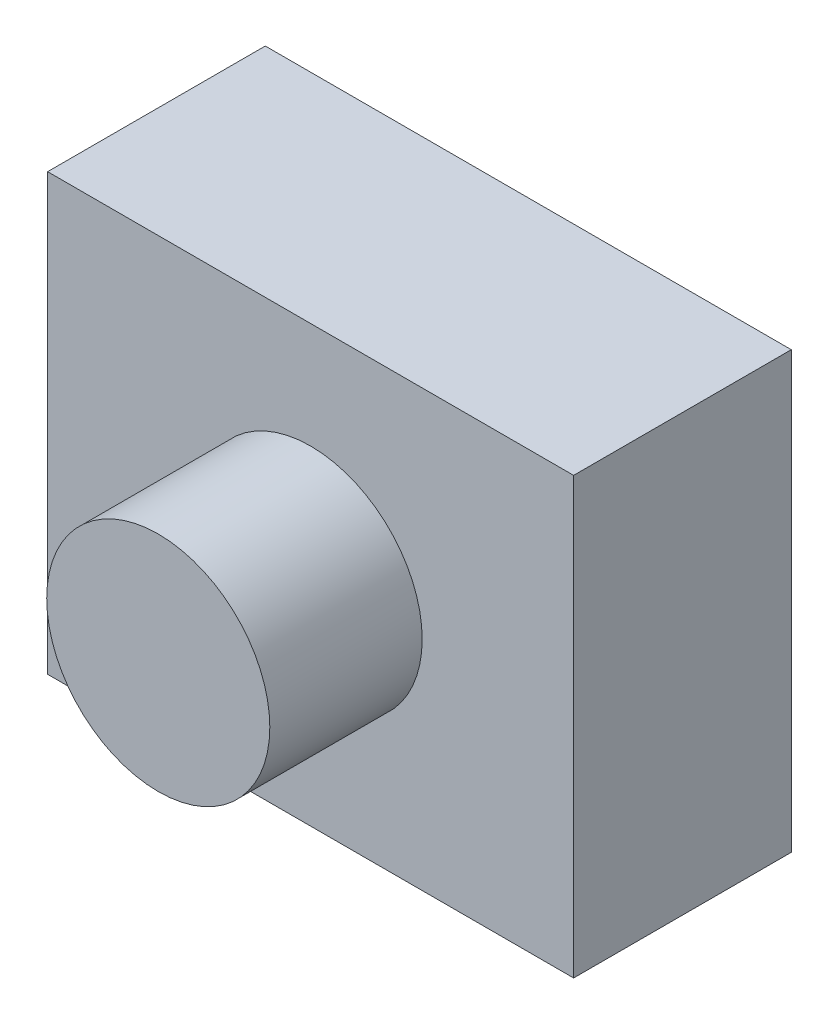
ISO-10303-21;
HEADER;
FILE_DESCRIPTION(('STEP AP214'),'2;1');
FILE_NAME('part.step','',(''),(''),'','','');
FILE_SCHEMA(('AUTOMOTIVE_DESIGN { 1 0 10303 214 1 1 1 1 }'));
ENDSEC;
DATA;
#1=APPLICATION_CONTEXT('core data for automotive mechanical design processes');
#2=APPLICATION_PROTOCOL_DEFINITION('international standard','automotive_design',2000,#1);
#3=PRODUCT_CONTEXT('',#1,'mechanical');
#4=PRODUCT('Part','Part','',(#3));
#5=PRODUCT_RELATED_PRODUCT_CATEGORY('part','',(#4));
#6=PRODUCT_DEFINITION_FORMATION('','',#4);
#7=PRODUCT_DEFINITION_CONTEXT('part definition',#1,'design');
#8=PRODUCT_DEFINITION('design','',#6,#7);
#9=PRODUCT_DEFINITION_SHAPE('','',#8);
#10=(LENGTH_UNIT() NAMED_UNIT(*) SI_UNIT(.MILLI.,.METRE.));
#11=(NAMED_UNIT(*) PLANE_ANGLE_UNIT() SI_UNIT($,.RADIAN.));
#12=(NAMED_UNIT(*) SI_UNIT($,.STERADIAN.) SOLID_ANGLE_UNIT());
#13=UNCERTAINTY_MEASURE_WITH_UNIT(LENGTH_MEASURE(1.E-05),#10,'distance_accuracy_value','');
#14=(GEOMETRIC_REPRESENTATION_CONTEXT(3) GLOBAL_UNCERTAINTY_ASSIGNED_CONTEXT((#13)) GLOBAL_UNIT_ASSIGNED_CONTEXT((#10,
#11,#12)) REPRESENTATION_CONTEXT('',''));
#15=CARTESIAN_POINT('',(0.,0.,0.));
#16=DIRECTION('',(0.,0.,1.));
#17=DIRECTION('',(1.,0.,0.));
#18=AXIS2_PLACEMENT_3D('',#15,#16,#17);
#19=CARTESIAN_POINT('',(-33.,0.,0.));
#20=DIRECTION('',(0.,1.,0.));
#21=DIRECTION('',(0.,0.,1.));
#22=AXIS2_PLACEMENT_3D('',#19,#20,#21);
#23=PLANE('',#22);
#24=DIRECTION('',(-1.,0.,0.));
#25=VECTOR('',#24,1.);
#26=CARTESIAN_POINT('',(-33.,0.,-120.));
#27=LINE('',#26,#25);
#28=CARTESIAN_POINT('',(-23.3333333333333,0.,-120.));
#29=VERTEX_POINT('',#28);
#30=CARTESIAN_POINT('',(-33.,0.,-120.));
#31=VERTEX_POINT('',#30);
#32=EDGE_CURVE('E14',#29,#31,#27,.T.);
#33=ORIENTED_EDGE('',*,*,#32,.F.);
#34=DIRECTION('',(0.,0.,-1.));
#35=VECTOR('',#34,1.);
#36=CARTESIAN_POINT('',(-23.3333333333333,0.,0.));
#37=LINE('',#36,#35);
#38=CARTESIAN_POINT('',(-23.3333333333333,0.,-124.));
#39=VERTEX_POINT('',#38);
#40=EDGE_CURVE('E159',#29,#39,#37,.T.);
#41=ORIENTED_EDGE('',*,*,#40,.T.);
#42=DIRECTION('',(1.,0.,0.));
#43=VECTOR('',#42,1.);
#44=CARTESIAN_POINT('',(-33.,0.,-124.));
#45=LINE('',#44,#43);
#46=CARTESIAN_POINT('',(-33.,0.,-124.));
#47=VERTEX_POINT('',#46);
#48=EDGE_CURVE('E150',#47,#39,#45,.T.);
#49=ORIENTED_EDGE('',*,*,#48,.F.);
#50=DIRECTION('',(0.,0.,-1.));
#51=VECTOR('',#50,1.);
#52=CARTESIAN_POINT('',(-33.,0.,0.));
#53=LINE('',#52,#51);
#54=EDGE_CURVE('E148',#31,#47,#53,.T.);
#55=ORIENTED_EDGE('',*,*,#54,.F.);
#56=EDGE_LOOP('',(#33,#41,#49,#55));
#57=FACE_BOUND('',#56,.T.);
#58=ADVANCED_FACE('F89',(#57),#23,.T.);
#59=CARTESIAN_POINT('',(-23.3333333333333,36.7021330200372,-5.15814840999424));
#60=DIRECTION('',(-1.,0.,0.));
#61=DIRECTION('',(0.,0.,-1.));
#62=AXIS2_PLACEMENT_3D('',#59,#60,#61);
#63=PLANE('',#62);
#64=DIRECTION('',(0.,-1.,0.));
#65=VECTOR('',#64,1.);
#66=CARTESIAN_POINT('',(-23.3333333333333,36.7021330200373,-120.));
#67=LINE('',#66,#65);
#68=CARTESIAN_POINT('',(-23.3333333333333,-7.99999999999966,-120.));
#69=VERTEX_POINT('',#68);
#70=EDGE_CURVE('E98',#29,#69,#67,.T.);
#71=ORIENTED_EDGE('',*,*,#70,.T.);
#72=DIRECTION('',(0.,0.,1.));
#73=VECTOR('',#72,1.);
#74=CARTESIAN_POINT('',(-23.3333333333333,-7.99999999999966,-124.));
#75=LINE('',#74,#73);
#76=CARTESIAN_POINT('',(-23.3333333333333,-7.99999999999966,-124.));
#77=VERTEX_POINT('',#76);
#78=EDGE_CURVE('E134',#77,#69,#75,.T.);
#79=ORIENTED_EDGE('',*,*,#78,.F.);
#80=DIRECTION('',(0.,-1.,0.));
#81=VECTOR('',#80,1.);
#82=CARTESIAN_POINT('',(-23.3333333333333,0.,-124.));
#83=LINE('',#82,#81);
#84=EDGE_CURVE('E144',#39,#77,#83,.T.);
#85=ORIENTED_EDGE('',*,*,#84,.F.);
#86=ORIENTED_EDGE('',*,*,#40,.F.);
#87=EDGE_LOOP('',(#71,#79,#85,#86));
#88=FACE_BOUND('',#87,.T.);
#89=ADVANCED_FACE('F174',(#88),#63,.F.);
#90=CARTESIAN_POINT('',(33.,0.,-124.));
#91=DIRECTION('',(0.,0.,-1.));
#92=DIRECTION('',(-1.,0.,0.));
#93=AXIS2_PLACEMENT_3D('',#90,#91,#92);
#94=PLANE('',#93);
#95=DIRECTION('',(-1.,0.,0.));
#96=VECTOR('',#95,1.);
#97=CARTESIAN_POINT('',(-1.96681751345241E-13,-8.00000000000035,-124.));
#98=LINE('',#97,#96);
#99=CARTESIAN_POINT('',(-33.,-7.99999999999966,-124.));
#100=VERTEX_POINT('',#99);
#101=EDGE_CURVE('E131',#77,#100,#98,.T.);
#102=ORIENTED_EDGE('',*,*,#101,.T.);
#103=DIRECTION('',(0.,-1.,0.));
#104=VECTOR('',#103,1.);
#105=CARTESIAN_POINT('',(-33.,0.,-124.));
#106=LINE('',#105,#104);
#107=EDGE_CURVE('E141',#47,#100,#106,.T.);
#108=ORIENTED_EDGE('',*,*,#107,.F.);
#109=ORIENTED_EDGE('',*,*,#48,.T.);
#110=ORIENTED_EDGE('',*,*,#84,.T.);
#111=EDGE_LOOP('',(#102,#108,#109,#110));
#112=FACE_BOUND('',#111,.T.);
#113=ADVANCED_FACE('F139',(#112),#94,.T.);
#114=CARTESIAN_POINT('',(33.,2.37904933848248E-13,-120.));
#115=DIRECTION('',(0.,0.,1.));
#116=DIRECTION('',(0.,-1.,0.));
#117=AXIS2_PLACEMENT_3D('',#114,#115,#116);
#118=PLANE('',#117);
#119=DIRECTION('',(-1.,0.,0.));
#120=VECTOR('',#119,1.);
#121=CARTESIAN_POINT('',(32.9999999999998,-8.00000000000116,-120.));
#122=LINE('',#121,#120);
#123=CARTESIAN_POINT('',(-33.,-7.99999999999954,-120.));
#124=VERTEX_POINT('',#123);
#125=EDGE_CURVE('E106',#69,#124,#122,.T.);
#126=ORIENTED_EDGE('',*,*,#125,.F.);
#127=ORIENTED_EDGE('',*,*,#70,.F.);
#128=ORIENTED_EDGE('',*,*,#32,.T.);
#129=DIRECTION('',(0.,1.,0.));
#130=VECTOR('',#129,1.);
#131=CARTESIAN_POINT('',(-33.,2.37904933848248E-13,-120.));
#132=LINE('',#131,#130);
#133=EDGE_CURVE('E113',#124,#31,#132,.T.);
#134=ORIENTED_EDGE('',*,*,#133,.F.);
#135=EDGE_LOOP('',(#126,#127,#128,#134));
#136=FACE_BOUND('',#135,.T.);
#137=CARTESIAN_POINT('',(-28.1666666666667,-3.99999999999977,-120.));
#138=DIRECTION('',(0.,0.,1.));
#139=DIRECTION('',(0.,-1.,0.));
#140=AXIS2_PLACEMENT_3D('',#137,#138,#139);
#141=CIRCLE('',#140,2.05);
#142=CARTESIAN_POINT('',(-28.1666666666667,-6.04999999999977,-120.));
#143=VERTEX_POINT('',#142);
#144=EDGE_CURVE('E93',#143,#143,#141,.T.);
#145=ORIENTED_EDGE('',*,*,#144,.F.);
#146=EDGE_LOOP('',(#145));
#147=FACE_BOUND('',#146,.T.);
#148=ADVANCED_FACE('F171',(#136,#147),#118,.T.);
#149=CARTESIAN_POINT('',(-33.,0.,0.));
#150=DIRECTION('',(-1.,0.,0.));
#151=DIRECTION('',(0.,0.,-1.));
#152=AXIS2_PLACEMENT_3D('',#149,#150,#151);
#153=PLANE('',#152);
#154=DIRECTION('',(0.,0.,1.));
#155=VECTOR('',#154,1.);
#156=CARTESIAN_POINT('',(-33.,-7.99999999999966,-124.));
#157=LINE('',#156,#155);
#158=EDGE_CURVE('E128',#100,#124,#157,.T.);
#159=ORIENTED_EDGE('',*,*,#158,.T.);
#160=ORIENTED_EDGE('',*,*,#133,.T.);
#161=ORIENTED_EDGE('',*,*,#54,.T.);
#162=ORIENTED_EDGE('',*,*,#107,.T.);
#163=EDGE_LOOP('',(#159,#160,#161,#162));
#164=FACE_BOUND('',#163,.T.);
#165=ADVANCED_FACE('F146',(#164),#153,.T.);
#166=CARTESIAN_POINT('',(-28.1666666666667,-3.99999999999977,-117.2));
#167=DIRECTION('',(0.,0.,-1.));
#168=DIRECTION('',(-1.,0.,0.));
#169=AXIS2_PLACEMENT_3D('',#166,#167,#168);
#170=CYLINDRICAL_SURFACE('',#169,2.05);
#171=CARTESIAN_POINT('',(-28.1666666666667,-3.99999999999977,-117.2));
#172=DIRECTION('',(0.,0.,1.));
#173=DIRECTION('',(1.,0.,0.));
#174=AXIS2_PLACEMENT_3D('',#171,#172,#173);
#175=CIRCLE('',#174,2.05);
#176=CARTESIAN_POINT('',(-26.1166666666667,-3.99999999999977,-117.2));
#177=VERTEX_POINT('',#176);
#178=EDGE_CURVE('E157',#177,#177,#175,.T.);
#179=ORIENTED_EDGE('',*,*,#178,.F.);
#180=EDGE_LOOP('',(#179));
#181=FACE_BOUND('',#180,.T.);
#182=ORIENTED_EDGE('',*,*,#144,.T.);
#183=EDGE_LOOP('',(#182));
#184=FACE_BOUND('',#183,.T.);
#185=ADVANCED_FACE('F91',(#181,#184),#170,.T.);
#186=CARTESIAN_POINT('',(0.,0.,-117.2));
#187=DIRECTION('',(0.,0.,1.));
#188=DIRECTION('',(1.,0.,0.));
#189=AXIS2_PLACEMENT_3D('',#186,#187,#188);
#190=PLANE('',#189);
#191=ORIENTED_EDGE('',*,*,#178,.T.);
#192=EDGE_LOOP('',(#191));
#193=FACE_BOUND('',#192,.T.);
#194=ADVANCED_FACE('F185',(#193),#190,.T.);
#195=CARTESIAN_POINT('',(-1.96681751345241E-13,-8.00000000000035,-124.));
#196=DIRECTION('',(0.,1.,0.));
#197=DIRECTION('',(-1.,0.,0.));
#198=AXIS2_PLACEMENT_3D('',#195,#196,#197);
#199=PLANE('',#198);
#200=ORIENTED_EDGE('',*,*,#125,.T.);
#201=ORIENTED_EDGE('',*,*,#158,.F.);
#202=ORIENTED_EDGE('',*,*,#101,.F.);
#203=ORIENTED_EDGE('',*,*,#78,.T.);
#204=EDGE_LOOP('',(#200,#201,#202,#203));
#205=FACE_BOUND('',#204,.T.);
#206=ADVANCED_FACE('F130',(#205),#199,.F.);
#207=CLOSED_SHELL('',(#58,#89,#113,#148,#165,#185,#194,#206));
#208=MANIFOLD_SOLID_BREP('B2',#207);
#209=ADVANCED_BREP_SHAPE_REPRESENTATION('',(#18,#208),#14);
#210=SHAPE_DEFINITION_REPRESENTATION(#9,#209);
ENDSEC;
END-ISO-10303-21;
